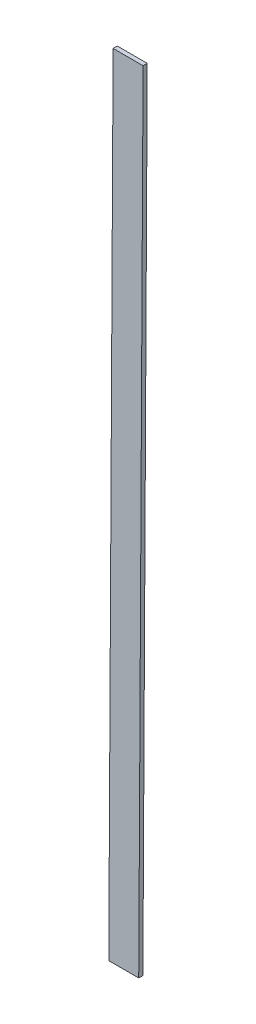
ISO-10303-21;
HEADER;
FILE_DESCRIPTION(('STEP AP214'),'2;1');
FILE_NAME('part.step','',(''),(''),'','','');
FILE_SCHEMA(('AUTOMOTIVE_DESIGN { 1 0 10303 214 1 1 1 1 }'));
ENDSEC;
DATA;
#1=APPLICATION_CONTEXT('core data for automotive mechanical design processes');
#2=APPLICATION_PROTOCOL_DEFINITION('international standard','automotive_design',2000,#1);
#3=PRODUCT_CONTEXT('',#1,'mechanical');
#4=PRODUCT('Part','Part','',(#3));
#5=PRODUCT_RELATED_PRODUCT_CATEGORY('part','',(#4));
#6=PRODUCT_DEFINITION_FORMATION('','',#4);
#7=PRODUCT_DEFINITION_CONTEXT('part definition',#1,'design');
#8=PRODUCT_DEFINITION('design','',#6,#7);
#9=PRODUCT_DEFINITION_SHAPE('','',#8);
#10=(LENGTH_UNIT() NAMED_UNIT(*) SI_UNIT(.MILLI.,.METRE.));
#11=(NAMED_UNIT(*) PLANE_ANGLE_UNIT() SI_UNIT($,.RADIAN.));
#12=(NAMED_UNIT(*) SI_UNIT($,.STERADIAN.) SOLID_ANGLE_UNIT());
#13=UNCERTAINTY_MEASURE_WITH_UNIT(LENGTH_MEASURE(1.E-05),#10,'distance_accuracy_value','');
#14=(GEOMETRIC_REPRESENTATION_CONTEXT(3) GLOBAL_UNCERTAINTY_ASSIGNED_CONTEXT((#13)) GLOBAL_UNIT_ASSIGNED_CONTEXT((#10,
#11,#12)) REPRESENTATION_CONTEXT('',''));
#15=CARTESIAN_POINT('',(0.,0.,0.));
#16=DIRECTION('',(0.,0.,1.));
#17=DIRECTION('',(1.,0.,0.));
#18=AXIS2_PLACEMENT_3D('',#15,#16,#17);
#19=CARTESIAN_POINT('',(26.0631170952802,-88.3607683059579,1.5875));
#20=DIRECTION('',(0.,-1.,0.));
#21=DIRECTION('',(1.,0.,0.));
#22=AXIS2_PLACEMENT_3D('',#19,#20,#21);
#23=PLANE('',#22);
#24=DIRECTION('',(-1.,0.,0.));
#25=VECTOR('',#24,1.);
#26=CARTESIAN_POINT('',(26.0631170952802,-88.3607683059579,0.));
#27=LINE('',#26,#25);
#28=CARTESIAN_POINT('',(26.0631170952802,-88.3607683059579,0.));
#29=VERTEX_POINT('',#28);
#30=CARTESIAN_POINT('',(14.6292046049732,-88.3607683059579,0.));
#31=VERTEX_POINT('',#30);
#32=EDGE_CURVE('E96',#29,#31,#27,.T.);
#33=ORIENTED_EDGE('',*,*,#32,.F.);
#34=DIRECTION('',(0.,0.,-1.));
#35=VECTOR('',#34,1.);
#36=CARTESIAN_POINT('',(26.0631170952802,-88.3607683059579,1.5875));
#37=LINE('',#36,#35);
#38=CARTESIAN_POINT('',(26.0631170952802,-88.3607683059579,1.5875));
#39=VERTEX_POINT('',#38);
#40=EDGE_CURVE('E11',#39,#29,#37,.T.);
#41=ORIENTED_EDGE('',*,*,#40,.F.);
#42=DIRECTION('',(-1.,0.,0.));
#43=VECTOR('',#42,1.);
#44=CARTESIAN_POINT('',(26.0631170952802,-88.3607683059579,1.5875));
#45=LINE('',#44,#43);
#46=CARTESIAN_POINT('',(14.6292046049732,-88.3607683059579,1.5875));
#47=VERTEX_POINT('',#46);
#48=EDGE_CURVE('E90',#39,#47,#45,.T.);
#49=ORIENTED_EDGE('',*,*,#48,.T.);
#50=DIRECTION('',(0.,0.,-1.));
#51=VECTOR('',#50,1.);
#52=CARTESIAN_POINT('',(14.6292046049732,-88.3607683059579,1.5875));
#53=LINE('',#52,#51);
#54=EDGE_CURVE('E35',#47,#31,#53,.T.);
#55=ORIENTED_EDGE('',*,*,#54,.T.);
#56=EDGE_LOOP('',(#33,#41,#49,#55));
#57=FACE_BOUND('',#56,.T.);
#58=ADVANCED_FACE('F32',(#57),#23,.T.);
#59=CARTESIAN_POINT('',(27.7283409313893,213.906354793111,1.5875));
#60=DIRECTION('',(0.999984825180596,-0.00550902972696874,0.));
#61=DIRECTION('',(0.00550902972696874,0.999984825180596,0.));
#62=AXIS2_PLACEMENT_3D('',#59,#60,#61);
#63=PLANE('',#62);
#64=DIRECTION('',(-0.00550902972696873,-0.999984825180596,0.));
#65=VECTOR('',#64,1.);
#66=CARTESIAN_POINT('',(27.7283409313893,213.906354793111,0.));
#67=LINE('',#66,#65);
#68=CARTESIAN_POINT('',(27.7283409313893,213.906354793111,0.));
#69=VERTEX_POINT('',#68);
#70=EDGE_CURVE('E92',#69,#29,#67,.T.);
#71=ORIENTED_EDGE('',*,*,#70,.F.);
#72=DIRECTION('',(0.,0.,-1.));
#73=VECTOR('',#72,1.);
#74=CARTESIAN_POINT('',(27.7283409313893,213.906354793111,1.5875));
#75=LINE('',#74,#73);
#76=CARTESIAN_POINT('',(27.7283409313893,213.906354793111,1.5875));
#77=VERTEX_POINT('',#76);
#78=EDGE_CURVE('E41',#77,#69,#75,.T.);
#79=ORIENTED_EDGE('',*,*,#78,.F.);
#80=DIRECTION('',(-0.00550902972696873,-0.999984825180596,0.));
#81=VECTOR('',#80,1.);
#82=CARTESIAN_POINT('',(27.7283409313893,213.906354793111,1.5875));
#83=LINE('',#82,#81);
#84=EDGE_CURVE('E87',#77,#39,#83,.T.);
#85=ORIENTED_EDGE('',*,*,#84,.T.);
#86=ORIENTED_EDGE('',*,*,#40,.T.);
#87=EDGE_LOOP('',(#71,#79,#85,#86));
#88=FACE_BOUND('',#87,.T.);
#89=ADVANCED_FACE('F106',(#88),#63,.T.);
#90=CARTESIAN_POINT('',(16.2944220330051,213.906354793112,1.5875));
#91=DIRECTION('',(0.,1.,0.));
#92=DIRECTION('',(-1.,0.,0.));
#93=AXIS2_PLACEMENT_3D('',#90,#91,#92);
#94=PLANE('',#93);
#95=DIRECTION('',(1.,0.,0.));
#96=VECTOR('',#95,1.);
#97=CARTESIAN_POINT('',(16.2944220330051,213.906354793112,0.));
#98=LINE('',#97,#96);
#99=CARTESIAN_POINT('',(16.2944220330051,213.906354793112,0.));
#100=VERTEX_POINT('',#99);
#101=EDGE_CURVE('E82',#100,#69,#98,.T.);
#102=ORIENTED_EDGE('',*,*,#101,.F.);
#103=DIRECTION('',(0.,0.,-1.));
#104=VECTOR('',#103,1.);
#105=CARTESIAN_POINT('',(16.2944220330051,213.906354793112,1.5875));
#106=LINE('',#105,#104);
#107=CARTESIAN_POINT('',(16.2944220330051,213.906354793112,1.5875));
#108=VERTEX_POINT('',#107);
#109=EDGE_CURVE('E77',#108,#100,#106,.T.);
#110=ORIENTED_EDGE('',*,*,#109,.F.);
#111=DIRECTION('',(1.,0.,0.));
#112=VECTOR('',#111,1.);
#113=CARTESIAN_POINT('',(16.2944220330051,213.906354793112,1.5875));
#114=LINE('',#113,#112);
#115=EDGE_CURVE('E80',#108,#77,#114,.T.);
#116=ORIENTED_EDGE('',*,*,#115,.T.);
#117=ORIENTED_EDGE('',*,*,#78,.T.);
#118=EDGE_LOOP('',(#102,#110,#116,#117));
#119=FACE_BOUND('',#118,.T.);
#120=ADVANCED_FACE('F79',(#119),#94,.T.);
#121=CARTESIAN_POINT('',(14.6292046049732,-88.3607683059579,1.5875));
#122=DIRECTION('',(-0.999984825297384,0.00550900852788693,0.));
#123=DIRECTION('',(-0.00550900852788693,-0.999984825297384,0.));
#124=AXIS2_PLACEMENT_3D('',#121,#122,#123);
#125=PLANE('',#124);
#126=DIRECTION('',(0.00550900852788693,0.999984825297384,0.));
#127=VECTOR('',#126,1.);
#128=CARTESIAN_POINT('',(14.6292046049732,-88.3607683059579,0.));
#129=LINE('',#128,#127);
#130=EDGE_CURVE('E99',#31,#100,#129,.T.);
#131=ORIENTED_EDGE('',*,*,#130,.F.);
#132=ORIENTED_EDGE('',*,*,#54,.F.);
#133=DIRECTION('',(0.00550900852788693,0.999984825297384,0.));
#134=VECTOR('',#133,1.);
#135=CARTESIAN_POINT('',(14.6292046049732,-88.3607683059579,1.5875));
#136=LINE('',#135,#134);
#137=EDGE_CURVE('E86',#47,#108,#136,.T.);
#138=ORIENTED_EDGE('',*,*,#137,.T.);
#139=ORIENTED_EDGE('',*,*,#109,.T.);
#140=EDGE_LOOP('',(#131,#132,#138,#139));
#141=FACE_BOUND('',#140,.T.);
#142=ADVANCED_FACE('F89',(#141),#125,.T.);
#143=CARTESIAN_POINT('',(0.,0.,1.5875));
#144=DIRECTION('',(0.,0.,-1.));
#145=DIRECTION('',(-1.,0.,0.));
#146=AXIS2_PLACEMENT_3D('',#143,#144,#145);
#147=PLANE('',#146);
#148=ORIENTED_EDGE('',*,*,#48,.F.);
#149=ORIENTED_EDGE('',*,*,#84,.F.);
#150=ORIENTED_EDGE('',*,*,#115,.F.);
#151=ORIENTED_EDGE('',*,*,#137,.F.);
#152=EDGE_LOOP('',(#148,#149,#150,#151));
#153=FACE_BOUND('',#152,.T.);
#154=ADVANCED_FACE('F85',(#153),#147,.F.);
#155=CARTESIAN_POINT('',(0.,0.,0.));
#156=DIRECTION('',(0.,0.,-1.));
#157=DIRECTION('',(-1.,0.,0.));
#158=AXIS2_PLACEMENT_3D('',#155,#156,#157);
#159=PLANE('',#158);
#160=ORIENTED_EDGE('',*,*,#32,.T.);
#161=ORIENTED_EDGE('',*,*,#130,.T.);
#162=ORIENTED_EDGE('',*,*,#101,.T.);
#163=ORIENTED_EDGE('',*,*,#70,.T.);
#164=EDGE_LOOP('',(#160,#161,#162,#163));
#165=FACE_BOUND('',#164,.T.);
#166=ADVANCED_FACE('F105',(#165),#159,.T.);
#167=CLOSED_SHELL('',(#58,#89,#120,#142,#154,#166));
#168=MANIFOLD_SOLID_BREP('B2',#167);
#169=ADVANCED_BREP_SHAPE_REPRESENTATION('',(#18,#168),#14);
#170=SHAPE_DEFINITION_REPRESENTATION(#9,#169);
ENDSEC;
END-ISO-10303-21;
